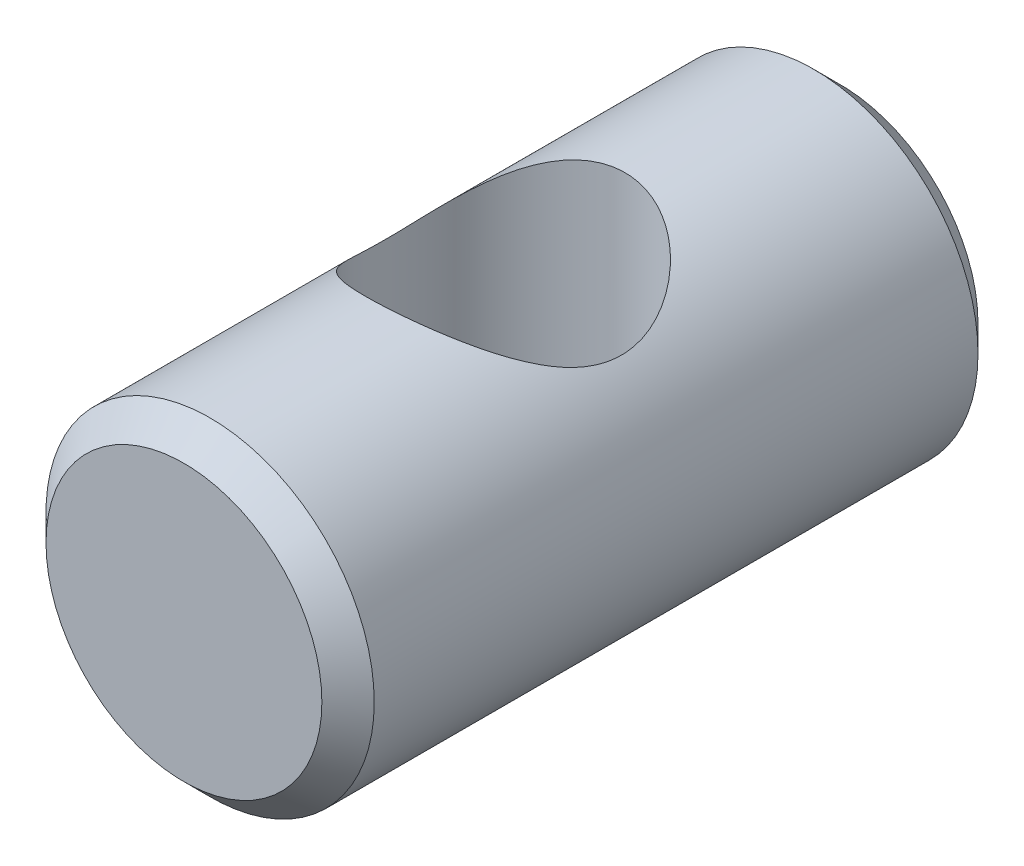
ISO-10303-21;
HEADER;
FILE_DESCRIPTION(('STEP AP214'),'2;1');
FILE_NAME('part.step','',(''),(''),'','','');
FILE_SCHEMA(('AUTOMOTIVE_DESIGN { 1 0 10303 214 1 1 1 1 }'));
ENDSEC;
DATA;
#1=APPLICATION_CONTEXT('core data for automotive mechanical design processes');
#2=APPLICATION_PROTOCOL_DEFINITION('international standard','automotive_design',2000,#1);
#3=PRODUCT_CONTEXT('',#1,'mechanical');
#4=PRODUCT('Part','Part','',(#3));
#5=PRODUCT_RELATED_PRODUCT_CATEGORY('part','',(#4));
#6=PRODUCT_DEFINITION_FORMATION('','',#4);
#7=PRODUCT_DEFINITION_CONTEXT('part definition',#1,'design');
#8=PRODUCT_DEFINITION('design','',#6,#7);
#9=PRODUCT_DEFINITION_SHAPE('','',#8);
#10=(LENGTH_UNIT() NAMED_UNIT(*) SI_UNIT(.MILLI.,.METRE.));
#11=(NAMED_UNIT(*) PLANE_ANGLE_UNIT() SI_UNIT($,.RADIAN.));
#12=(NAMED_UNIT(*) SI_UNIT($,.STERADIAN.) SOLID_ANGLE_UNIT());
#13=UNCERTAINTY_MEASURE_WITH_UNIT(LENGTH_MEASURE(1.E-05),#10,'distance_accuracy_value','');
#14=(GEOMETRIC_REPRESENTATION_CONTEXT(3) GLOBAL_UNCERTAINTY_ASSIGNED_CONTEXT((#13)) GLOBAL_UNIT_ASSIGNED_CONTEXT((#10,
#11,#12)) REPRESENTATION_CONTEXT('',''));
#15=CARTESIAN_POINT('',(0.,0.,0.));
#16=DIRECTION('',(0.,0.,1.));
#17=DIRECTION('',(1.,0.,0.));
#18=AXIS2_PLACEMENT_3D('',#15,#16,#17);
#19=CARTESIAN_POINT('',(0.,0.,9.525));
#20=DIRECTION('',(0.,0.,-1.));
#21=DIRECTION('',(-1.,0.,0.));
#22=AXIS2_PLACEMENT_3D('',#19,#20,#21);
#23=CYLINDRICAL_SURFACE('',#22,4.765);
#24=CARTESIAN_POINT('',(0.,-4.765,-3.42087708051605));
#25=CARTESIAN_POINT('',(-0.0833627581168181,-4.7649997101109,-3.42696899134863));
#26=CARTESIAN_POINT('',(-0.166953392424251,-4.76280757869707,-3.43001003086423));
#27=CARTESIAN_POINT('',(-0.333933182408652,-4.75402028790231,-3.4299899120654));
#28=CARTESIAN_POINT('',(-0.41732223719261,-4.74742325494959,-3.42692615604904));
#29=CARTESIAN_POINT('',(-0.583312250165056,-4.72989865727235,-3.41478160746824));
#30=CARTESIAN_POINT('',(-0.665912068503747,-4.71896558414041,-3.40569315136156));
#31=CARTESIAN_POINT('',(-0.829610597514771,-4.69295834085159,-3.38168739143667));
#32=CARTESIAN_POINT('',(-0.91070865358331,-4.67788240819801,-3.36676760565251));
#33=CARTESIAN_POINT('',(-1.15000632689336,-4.62699847385246,-3.31382161536753));
#34=CARTESIAN_POINT('',(-1.30524951697123,-4.58542013528299,-3.26752778272676));
#35=CARTESIAN_POINT('',(-1.60411463212557,-4.48962808746058,-3.15544383432779));
#36=CARTESIAN_POINT('',(-1.74773682156028,-4.43541466574349,-3.08965416222603));
#37=CARTESIAN_POINT('',(-2.03259497643689,-4.31273538578719,-2.93522566350036));
#38=CARTESIAN_POINT('',(-2.17272279857911,-4.24347672491827,-2.84518090003159));
#39=CARTESIAN_POINT('',(-2.43631552731587,-4.09784606286129,-2.64803347355049));
#40=CARTESIAN_POINT('',(-2.55976291960052,-4.02146672501527,-2.54091313456509));
#41=CARTESIAN_POINT('',(-2.81327393100644,-3.84950291536883,-2.28757037498761));
#42=CARTESIAN_POINT('',(-2.93940806717613,-3.75321839663728,-2.13784494064544));
#43=CARTESIAN_POINT('',(-3.10885207016274,-3.61188607024724,-1.89774924473951));
#44=CARTESIAN_POINT('',(-3.16205944901992,-3.56527135977744,-1.81509327318893));
#45=CARTESIAN_POINT('',(-3.26165283895997,-3.47438917550769,-1.64456461914389));
#46=CARTESIAN_POINT('',(-3.30804141803447,-3.43012082209569,-1.55669391813204));
#47=CARTESIAN_POINT('',(-3.41144333221737,-3.32784018306176,-1.33801732923479));
#48=CARTESIAN_POINT('',(-3.46485738281701,-3.27176419567389,-1.20454764001565));
#49=CARTESIAN_POINT('',(-3.55539465585279,-3.1731532714438,-0.927567219273259));
#50=CARTESIAN_POINT('',(-3.59255605597934,-3.13058666617785,-0.784080947165172));
#51=CARTESIAN_POINT('',(-3.64343651296181,-3.07113542283653,-0.514646140223208));
#52=CARTESIAN_POINT('',(-3.66010628533956,-3.05107413064414,-0.389980532152302));
#53=CARTESIAN_POINT('',(-3.67954153570878,-3.02761567970702,-0.138051441971629));
#54=CARTESIAN_POINT('',(-3.68232117171679,-3.02420155283186,-0.0107907379518645));
#55=CARTESIAN_POINT('',(-3.67376621747767,-3.03458366659267,0.242449329866107));
#56=CARTESIAN_POINT('',(-3.66243797397314,-3.04837216824954,0.36842924415841));
#57=CARTESIAN_POINT('',(-3.62657095184853,-3.09094772918142,0.615927376424318));
#58=CARTESIAN_POINT('',(-3.60201250089043,-3.11975712134959,0.737438661719832));
#59=CARTESIAN_POINT('',(-3.52797021750044,-3.20358122773375,1.02486117239319));
#60=CARTESIAN_POINT('',(-3.47231020523667,-3.26453704351351,1.18741075414518));
#61=CARTESIAN_POINT('',(-3.34017866781708,-3.39961296516166,1.498121783823));
#62=CARTESIAN_POINT('',(-3.2636446149314,-3.47377238661047,1.64623815847782));
#63=CARTESIAN_POINT('',(-3.12200897105521,-3.60054284241464,1.87825971607124));
#64=CARTESIAN_POINT('',(-3.06234750531042,-3.65156363596669,1.9664324955114));
#65=CARTESIAN_POINT('',(-2.93536296354977,-3.75440484501345,2.13658829521524));
#66=CARTESIAN_POINT('',(-2.86803758566651,-3.80622549668558,2.21856944344932));
#67=CARTESIAN_POINT('',(-2.65493557738645,-3.96070606463684,2.4548169203279));
#68=CARTESIAN_POINT('',(-2.4978237985218,-4.06258137631192,2.59972905493882));
#69=CARTESIAN_POINT('',(-2.18575837138568,-4.23718725327564,2.83706621766583));
#70=CARTESIAN_POINT('',(-2.03548298499758,-4.31186637762032,2.93424360521689));
#71=CARTESIAN_POINT('',(-1.71702572980925,-4.44824656330391,3.10568912436018));
#72=CARTESIAN_POINT('',(-1.54887024912961,-4.50996636079322,3.17999040299218));
#73=CARTESIAN_POINT('',(-1.22389848309852,-4.60778480850806,3.29263516387729));
#74=CARTESIAN_POINT('',(-1.06910753325383,-4.64632732736096,3.33468022800881));
#75=CARTESIAN_POINT('',(-0.75219098421797,-4.70801774696666,3.39687013419293));
#76=CARTESIAN_POINT('',(-0.590069112764686,-4.73117337991453,3.4170259792185));
#77=CARTESIAN_POINT('',(-0.262598143568302,-4.7606051003247,3.43390286080123));
#78=CARTESIAN_POINT('',(-0.0972412962651627,-4.76683385814853,3.43055828056669));
#79=CARTESIAN_POINT('',(0.231024129353294,-4.76222706928004,3.40010195996678));
#80=CARTESIAN_POINT('',(0.393932420256087,-4.75138953488968,3.37298745129903));
#81=CARTESIAN_POINT('',(0.705514268669749,-4.71498049061455,3.29795083571309));
#82=CARTESIAN_POINT('',(0.854498752183595,-4.69006694126301,3.25098003249397));
#83=CARTESIAN_POINT('',(1.14256413370517,-4.62833634686259,3.13840780618742));
#84=CARTESIAN_POINT('',(1.28164310390505,-4.59151699239254,3.07280276883643));
#85=CARTESIAN_POINT('',(1.5605913242394,-4.50478911028579,2.91796402171938));
#86=CARTESIAN_POINT('',(1.6992420339739,-4.45396042558585,2.82706121692328));
#87=CARTESIAN_POINT('',(1.96045324775842,-4.34533105232053,2.62789389216064));
#88=CARTESIAN_POINT('',(2.08299871660834,-4.28752394420402,2.51961335554432));
#89=CARTESIAN_POINT('',(2.33061071233595,-4.15886196775128,2.26753986981794));
#90=CARTESIAN_POINT('',(2.4524560274696,-4.08747815085455,2.12084350362776));
#91=CARTESIAN_POINT('',(2.67091966387117,-3.94818744226299,1.80818256348861));
#92=CARTESIAN_POINT('',(2.76753692468302,-3.88028069682256,1.64221717999394));
#93=CARTESIAN_POINT('',(2.91829752704228,-3.76775877390235,1.32363316444147));
#94=CARTESIAN_POINT('',(2.97693831230802,-3.72114907301219,1.17388770573104));
#95=CARTESIAN_POINT('',(3.04915600293589,-3.66180847873486,0.941826581338288));
#96=CARTESIAN_POINT('',(3.0706008978109,-3.64379412637323,0.863255129060429));
#97=CARTESIAN_POINT('',(3.10797188341904,-3.61197174564401,0.703992654043783));
#98=CARTESIAN_POINT('',(3.12390068817333,-3.59816164910817,0.623302694735667));
#99=CARTESIAN_POINT('',(3.15010468685879,-3.57524455910332,0.459495462666012));
#100=CARTESIAN_POINT('',(3.16032158062367,-3.5661861203942,0.376361962516609));
#101=CARTESIAN_POINT('',(3.17464168800661,-3.55344451616001,0.209195138832906));
#102=CARTESIAN_POINT('',(3.17874788699032,-3.54975872585817,0.125162274904951));
#103=CARTESIAN_POINT('',(3.18076053743013,-3.54795587812489,-0.0430393452037699));
#104=CARTESIAN_POINT('',(3.17866722999483,-3.54983860412504,-0.127208095972439));
#105=CARTESIAN_POINT('',(3.16833758034575,-3.55905933774995,-0.294840628996082));
#106=CARTESIAN_POINT('',(3.16010150131517,-3.56639711165655,-0.37830444129877));
#107=CARTESIAN_POINT('',(3.129430196119,-3.59341005189328,-0.604314657609787));
#108=CARTESIAN_POINT('',(3.10101793603989,-3.61818171011667,-0.745494317394037));
#109=CARTESIAN_POINT('',(3.02771937958645,-3.67972750014127,-1.02069983126741));
#110=CARTESIAN_POINT('',(2.98281650470617,-3.71651370639189,-1.15471833017231));
#111=CARTESIAN_POINT('',(2.8560768918245,-3.8153502491925,-1.46853642894097));
#112=CARTESIAN_POINT('',(2.76664814536404,-3.88152734494911,-1.64398166227299));
#113=CARTESIAN_POINT('',(2.56077346334119,-4.02033820070584,-1.97551522842484));
#114=CARTESIAN_POINT('',(2.44428083509273,-4.09298298410994,-2.13156938380249));
#115=CARTESIAN_POINT('',(2.18450650401399,-4.2373970566927,-2.42421216807333));
#116=CARTESIAN_POINT('',(2.04090097393914,-4.30914323590254,-2.56052605726515));
#117=CARTESIAN_POINT('',(1.72973058522059,-4.44318432752427,-2.80802181758103));
#118=CARTESIAN_POINT('',(1.56219804304703,-4.50549175797245,-2.91923707314103));
#119=CARTESIAN_POINT('',(1.23969583506405,-4.60338031575656,-3.09396462152009));
#120=CARTESIAN_POINT('',(1.08834922542923,-4.64178783933997,-3.16252149709776));
#121=CARTESIAN_POINT('',(0.853387810710914,-4.68864069192958,-3.24875451241662));
#122=CARTESIAN_POINT('',(0.773800863355163,-4.70245945854321,-3.27471971164357));
#123=CARTESIAN_POINT('',(0.612411306870991,-4.72618391319332,-3.32087000112459));
#124=CARTESIAN_POINT('',(0.530609679466052,-4.73609130567107,-3.34105760799584));
#125=CARTESIAN_POINT('',(0.374335243630171,-4.75084997254152,-3.37353939001354));
#126=CARTESIAN_POINT('',(0.300030947704153,-4.75613339853629,-3.38645258471521));
#127=CARTESIAN_POINT('',(0.150546671086997,-4.76320900575073,-3.40736829831093));
#128=CARTESIAN_POINT('',(0.0753664637160956,-4.76500026208246,-3.41536951590209));
#129=CARTESIAN_POINT('',(0.,-4.765,-3.42087708051605));
#130=B_SPLINE_CURVE_WITH_KNOTS('',3,(#24,#25,#26,#27,#28,#29,#30,#31,#32,#33,#34,#35,#36,#37,
#38,#39,#40,#41,#42,#43,#44,#45,#46,#47,#48,#49,#50,#51,#52,#53,#54,#55,#56,#57,#58,#59,#60,#61,
#62,#63,#64,#65,#66,#67,#68,#69,#70,#71,#72,#73,#74,#75,#76,#77,#78,#79,#80,#81,#82,#83,#84,#85,
#86,#87,#88,#89,#90,#91,#92,#93,#94,#95,#96,#97,#98,#99,#100,#101,#102,#103,#104,#105,#106,#107,
#108,#109,#110,#111,#112,#113,#114,#115,#116,#117,#118,#119,#120,#121,#122,#123,#124,#125,#126,
#127,#128,#129),.UNSPECIFIED.,.T.,.F.,(4,2,2,2,2,2,2,2,2,2,2,2,2,2,2,2,2,2,2,2,2,2,2,2,2,2,2,2,
2,2,2,2,2,2,2,2,2,2,2,2,2,2,2,2,2,2,2,2,2,2,2,2,4),(0.,0.250678148817341,0.501462988541287,
0.752567445437252,1.00377889552888,1.50309474088369,2.00239922444642,2.54160992918404,
3.08138247258981,3.73300244855075,4.05909733145616,4.38506908912952,4.84654436743379,
5.30692973453839,5.68734604359481,6.06737452056514,6.44723209503533,6.82765605484285,
7.37157480546313,7.91714109472132,8.27090631470675,8.62477807035776,9.33119791439566,
9.91077027397039,10.4894988486046,10.9822712500665,11.4747958366297,11.9686961727678,
12.4626540373564,12.9352342359093,13.4079061579591,13.9261848288361,14.4449439577641,
15.0533142145202,15.6617100398795,16.1619385675779,16.4119146790501,16.6617676221917,
16.9141262556176,17.1663615593023,17.4185870532858,17.6708017414466,18.1072101440206,
18.5440584873629,19.1640002904501,19.7850197135797,20.4139885307568,21.0421157411608,
21.5513660687497,21.8056438515067,22.059810706191,22.2863833912941,22.5130160751694),.UNSPECIFIED.);
#131=CARTESIAN_POINT('',(0.,-4.765,-3.42087708051605));
#132=VERTEX_POINT('',#131);
#133=EDGE_CURVE('E10',#132,#132,#130,.T.);
#134=ORIENTED_EDGE('',*,*,#133,.T.);
#135=EDGE_LOOP('',(#134));
#136=FACE_BOUND('',#135,.T.);
#137=CARTESIAN_POINT('',(-0.25,4.75843724346555,3.43));
#138=CARTESIAN_POINT('',(-0.422180009069406,4.749390618167,3.42999980483541));
#139=CARTESIAN_POINT('',(-0.59386282730199,4.73091871113112,3.41695856293195));
#140=CARTESIAN_POINT('',(-0.930629104770302,4.67635636796384,3.36610979440147));
#141=CARTESIAN_POINT('',(-1.09570851357914,4.64025529237457,3.32828730721862));
#142=CARTESIAN_POINT('',(-1.41392411864396,4.55336447971862,3.23075051942857));
#143=CARTESIAN_POINT('',(-1.56712334101048,4.5026601113221,3.17116292636266));
#144=CARTESIAN_POINT('',(-1.85998836726663,4.38979766700268,3.03299834240104));
#145=CARTESIAN_POINT('',(-1.99965414606241,4.32763956984278,2.95442131629586));
#146=CARTESIAN_POINT('',(-2.27820698899914,4.18828982189439,2.77162910883962));
#147=CARTESIAN_POINT('',(-2.41542819149111,4.11020218068904,2.66557505303866));
#148=CARTESIAN_POINT('',(-2.67111072919315,3.94883137284482,2.43572487373919));
#149=CARTESIAN_POINT('',(-2.78953546002452,3.86553849846079,2.31189500490524));
#150=CARTESIAN_POINT('',(-2.96344629098399,3.732292646302,2.10063521621267));
#151=CARTESIAN_POINT('',(-3.02522112465854,3.68226630299909,2.01833701427756));
#152=CARTESIAN_POINT('',(-3.14150590868554,3.58357003530251,1.84790207991889));
#153=CARTESIAN_POINT('',(-3.1960131207988,3.5349006275963,1.7597631654945));
#154=CARTESIAN_POINT('',(-3.29731229261899,3.44060115304685,1.57784833521894));
#155=CARTESIAN_POINT('',(-3.34411822611588,3.39496567295495,1.48408305992192));
#156=CARTESIAN_POINT('',(-3.42959137880208,3.30859742398811,1.29083456033671));
#157=CARTESIAN_POINT('',(-3.46826509160405,3.2678607546062,1.19135597958454));
#158=CARTESIAN_POINT('',(-3.54347659526858,3.18632211811376,0.966712328692859));
#159=CARTESIAN_POINT('',(-3.57812346664731,3.14705996480953,0.840323998552467));
#160=CARTESIAN_POINT('',(-3.63302442402354,3.08352956814293,0.58097620836193));
#161=CARTESIAN_POINT('',(-3.65331272726122,3.05922569654857,0.448033183521055));
#162=CARTESIAN_POINT('',(-3.67812283683354,3.02936636632518,0.177337549423229));
#163=CARTESIAN_POINT('',(-3.68251233934075,3.02396824643502,0.0395541719109326));
#164=CARTESIAN_POINT('',(-3.67470644643728,3.03344305810687,-0.23487587460697));
#165=CARTESIAN_POINT('',(-3.66249943392474,3.04833018879986,-0.371521679960182));
#166=CARTESIAN_POINT('',(-3.62015799382368,3.09852315491188,-0.655828380639311));
#167=CARTESIAN_POINT('',(-3.58799174144691,3.13612809889826,-0.802759414360213));
#168=CARTESIAN_POINT('',(-3.50660899556505,3.22685391573892,-1.08690765852794));
#169=CARTESIAN_POINT('',(-3.45734815065714,3.28001509196861,-1.22409847190397));
#170=CARTESIAN_POINT('',(-3.35999029035731,3.37921222953507,-1.45031682658415));
#171=CARTESIAN_POINT('',(-3.31552748835514,3.42299124550292,-1.54196683547208));
#172=CARTESIAN_POINT('',(-3.21937168211258,3.51357799533849,-1.7198719105116));
#173=CARTESIAN_POINT('',(-3.16767569861283,3.56038697291962,-1.80612473233374));
#174=CARTESIAN_POINT('',(-3.05733519065029,3.65557723444101,-1.97327341136436));
#175=CARTESIAN_POINT('',(-2.99868376029761,3.70396004583247,-2.05416381804876));
#176=CARTESIAN_POINT('',(-2.87465956601933,3.80102084509467,-2.21043246978884));
#177=CARTESIAN_POINT('',(-2.80928649472037,3.84969884636826,-2.28581046249784));
#178=CARTESIAN_POINT('',(-2.6702557671566,3.94744940552613,-2.43263894546763));
#179=CARTESIAN_POINT('',(-2.59643405525365,3.99650228404324,-2.50394748039488));
#180=CARTESIAN_POINT('',(-2.44198609531555,4.09270177982323,-2.64020867362414));
#181=CARTESIAN_POINT('',(-2.36135999487914,4.13984843840248,-2.70516146972696));
#182=CARTESIAN_POINT('',(-2.19361254846785,4.2311207520192,-2.82808330517596));
#183=CARTESIAN_POINT('',(-2.10650409604225,4.27525208591359,-2.88606563800174));
#184=CARTESIAN_POINT('',(-1.92594548966524,4.3595756679867,-2.99452956360935));
#185=CARTESIAN_POINT('',(-1.83249514460759,4.39976779737237,-3.04501093021117));
#186=CARTESIAN_POINT('',(-1.58991791011193,4.49465680101692,-3.16160717844564));
#187=CARTESIAN_POINT('',(-1.43688887677842,4.54617300319559,-3.22239703143537));
#188=CARTESIAN_POINT('',(-1.11985321098478,4.63445714602499,-3.3220213557935));
#189=CARTESIAN_POINT('',(-0.955854490731871,4.67123558567514,-3.36087146486794));
#190=CARTESIAN_POINT('',(-0.620041304864633,4.72756501903715,-3.41423360193657));
#191=CARTESIAN_POINT('',(-0.448189976813921,4.74702354164412,-3.42861536060857));
#192=CARTESIAN_POINT('',(-0.103195532056556,4.76701209164517,-3.43119218349009));
#193=CARTESIAN_POINT('',(0.06994727139145,4.76754656888776,-3.41939340455174));
#194=CARTESIAN_POINT('',(0.396800733953036,4.75102741592386,-3.37216085402572));
#195=CARTESIAN_POINT('',(0.550903795546914,4.73547935394817,-3.33884247322146));
#196=CARTESIAN_POINT('',(0.851262679297082,4.69080460019725,-3.25216372524372));
#197=CARTESIAN_POINT('',(0.997516834516372,4.66167503663273,-3.19879911978833));
#198=CARTESIAN_POINT('',(1.28614476637547,4.59066745677348,-3.0710403225626));
#199=CARTESIAN_POINT('',(1.42797966766526,4.5482360225696,-2.99574591149816));
#200=CARTESIAN_POINT('',(1.69771873358212,4.45459184021555,-2.82781924377908));
#201=CARTESIAN_POINT('',(1.82561916137349,4.40337674596602,-2.73518235437366));
#202=CARTESIAN_POINT('',(2.08559098582612,4.28706511495821,-2.51852707855975));
#203=CARTESIAN_POINT('',(2.2150420244168,4.22105957781513,-2.39185853378127));
#204=CARTESIAN_POINT('',(2.4525288591269,4.08765163666692,-2.11988296233599));
#205=CARTESIAN_POINT('',(2.56051870491995,4.02024656957631,-1.97453701758846));
#206=CARTESIAN_POINT('',(2.71141297716131,3.91890470250436,-1.73364032653499));
#207=CARTESIAN_POINT('',(2.76225962831151,3.88310759046257,-1.64375989611526));
#208=CARTESIAN_POINT('',(2.85606768069206,3.81463871939836,-1.45876664530863));
#209=CARTESIAN_POINT('',(2.8990272649147,3.78196768138302,-1.36365262576038));
#210=CARTESIAN_POINT('',(2.97638382467227,3.7213945324715,-1.16888238761678));
#211=CARTESIAN_POINT('',(3.01080676435227,3.6934780438477,-1.06924106056855));
#212=CARTESIAN_POINT('',(3.07061216797024,3.64390866973889,-0.865836413850729));
#213=CARTESIAN_POINT('',(3.09600079900905,3.62225151334222,-0.762075960014789));
#214=CARTESIAN_POINT('',(3.14431905107756,3.58048576732931,-0.514276109849917));
#215=CARTESIAN_POINT('',(3.1632690781055,3.56357947310397,-0.368863877264377));
#216=CARTESIAN_POINT('',(3.18229415057448,3.54660528363274,-0.0759553160984811));
#217=CARTESIAN_POINT('',(3.18238833621042,3.54652031339164,0.0715387471135857));
#218=CARTESIAN_POINT('',(3.16376347579515,3.56313911837428,0.364127843469745));
#219=CARTESIAN_POINT('',(3.14506985693007,3.57982020262542,0.509225849632988));
#220=CARTESIAN_POINT('',(3.09006178812862,3.6274007096972,0.793694678976371));
#221=CARTESIAN_POINT('',(3.05372153995533,3.65832094581284,0.93305679207045));
#222=CARTESIAN_POINT('',(2.94995679839854,3.74283457822027,1.249627259653));
#223=CARTESIAN_POINT('',(2.8761691317453,3.80056128592335,1.42363336901505));
#224=CARTESIAN_POINT('',(2.70309172031867,3.92554694052951,1.75476054116614));
#225=CARTESIAN_POINT('',(2.60375916203549,3.99282180458683,1.91185262262683));
#226=CARTESIAN_POINT('',(2.37965965281677,4.1303821812455,2.21024978907531));
#227=CARTESIAN_POINT('',(2.25446848393284,4.20070005001654,2.35122119961122));
#228=CARTESIAN_POINT('',(1.98132226028617,4.33621841215064,2.61183089931649));
#229=CARTESIAN_POINT('',(1.83339056066264,4.40142405331531,2.73149080683867));
#230=CARTESIAN_POINT('',(1.53413492006617,4.51378899534322,2.93439863762913));
#231=CARTESIAN_POINT('',(1.38501302638155,4.56214832085995,3.02021473285691));
#232=CARTESIAN_POINT('',(1.07249564524744,4.64554146755817,3.16951406225263));
#233=CARTESIAN_POINT('',(0.909111289256097,4.68058556855773,3.23301452201411));
#234=CARTESIAN_POINT('',(0.581478494873652,4.73212589223905,3.33183530764178));
#235=CARTESIAN_POINT('',(0.417802064196764,4.74955942472212,3.36854686433097));
#236=CARTESIAN_POINT('',(0.0859254534274394,4.76711849433294,3.41762518536938));
#237=CARTESIAN_POINT('',(-0.0822731758795966,4.76724989098796,3.43000019011694));
#238=CARTESIAN_POINT('',(-0.25,4.75843724346555,3.43));
#239=B_SPLINE_CURVE_WITH_KNOTS('',3,(#137,#138,#139,#140,#141,#142,#143,#144,#145,#146,#147,
#148,#149,#150,#151,#152,#153,#154,#155,#156,#157,#158,#159,#160,#161,#162,#163,#164,#165,#166,
#167,#168,#169,#170,#171,#172,#173,#174,#175,#176,#177,#178,#179,#180,#181,#182,#183,#184,#185,
#186,#187,#188,#189,#190,#191,#192,#193,#194,#195,#196,#197,#198,#199,#200,#201,#202,#203,#204,
#205,#206,#207,#208,#209,#210,#211,#212,#213,#214,#215,#216,#217,#218,#219,#220,#221,#222,#223,
#224,#225,#226,#227,#228,#229,#230,#231,#232,#233,#234,#235,#236,#237,#238),.UNSPECIFIED.,.T.,
.F.,(4,2,2,2,2,2,2,2,2,2,2,2,2,2,2,2,2,2,2,2,2,2,2,2,2,2,2,2,2,2,2,2,2,2,2,2,2,2,2,2,2,2,2,2,2,
2,2,2,2,2,4),(0.,0.516551025096824,1.03341418220019,1.54731512007828,2.06121701081903,
2.62982932183038,3.19953571462131,3.54246459279583,3.88552231417978,4.22795053195656,
4.57010427222594,4.97905439316964,5.38702665221779,5.79838620186915,6.21003384012951,
6.67262967068467,7.1364347778277,7.46866532411958,7.80103311718076,8.13373371721725,
8.46644953806418,8.80733809568013,9.14821926074384,9.48843965067855,9.82867029735157,
10.3440014803113,10.8589648922706,11.3766614843259,11.8942363430695,12.3673901670618,
12.8406440841658,13.3370245096255,13.8335377244494,14.4096746680997,14.9870321881218,
15.3145391492316,15.6421214663625,15.968694875667,16.2950449261748,16.7357599059526,
17.1760275223247,17.6157000871626,18.0560173690192,18.6457302885718,19.2364380888803,
19.8377403374759,20.4384291081866,20.9723943239786,21.5059464582794,22.0093081125728,
22.5124992983782),.UNSPECIFIED.);
#240=CARTESIAN_POINT('',(-0.25,4.75843724346555,3.43));
#241=VERTEX_POINT('',#240);
#242=EDGE_CURVE('E56',#241,#241,#239,.T.);
#243=ORIENTED_EDGE('',*,*,#242,.T.);
#244=EDGE_LOOP('',(#243));
#245=FACE_BOUND('',#244,.T.);
#246=CARTESIAN_POINT('',(0.,0.,-8.76499999999999));
#247=DIRECTION('',(0.,0.,1.));
#248=DIRECTION('',(1.,0.,0.));
#249=AXIS2_PLACEMENT_3D('',#246,#247,#248);
#250=CIRCLE('',#249,4.765);
#251=CARTESIAN_POINT('',(4.765,0.,-8.76499999999999));
#252=VERTEX_POINT('',#251);
#253=EDGE_CURVE('E99',#252,#252,#250,.T.);
#254=ORIENTED_EDGE('',*,*,#253,.T.);
#255=EDGE_LOOP('',(#254));
#256=FACE_BOUND('',#255,.T.);
#257=CARTESIAN_POINT('',(0.,0.,8.76500000000001));
#258=DIRECTION('',(0.,0.,1.));
#259=DIRECTION('',(1.,0.,0.));
#260=AXIS2_PLACEMENT_3D('',#257,#258,#259);
#261=CIRCLE('',#260,4.765);
#262=CARTESIAN_POINT('',(4.765,0.,8.76500000000001));
#263=VERTEX_POINT('',#262);
#264=EDGE_CURVE('E102',#263,#263,#261,.F.);
#265=ORIENTED_EDGE('',*,*,#264,.T.);
#266=EDGE_LOOP('',(#265));
#267=FACE_BOUND('',#266,.T.);
#268=ADVANCED_FACE('F42',(#136,#245,#256,#267),#23,.T.);
#269=CARTESIAN_POINT('',(0.,0.,9.525));
#270=DIRECTION('',(0.,0.,1.));
#271=DIRECTION('',(1.,0.,0.));
#272=AXIS2_PLACEMENT_3D('',#269,#270,#271);
#273=PLANE('',#272);
#274=CARTESIAN_POINT('',(0.,0.,9.525));
#275=DIRECTION('',(0.,0.,1.));
#276=DIRECTION('',(1.,0.,0.));
#277=AXIS2_PLACEMENT_3D('',#274,#275,#276);
#278=CIRCLE('',#277,4.00500000000001);
#279=CARTESIAN_POINT('',(4.00500000000001,0.,9.525));
#280=VERTEX_POINT('',#279);
#281=EDGE_CURVE('E61',#280,#280,#278,.T.);
#282=ORIENTED_EDGE('',*,*,#281,.T.);
#283=EDGE_LOOP('',(#282));
#284=FACE_BOUND('',#283,.T.);
#285=ADVANCED_FACE('F79',(#284),#273,.T.);
#286=CARTESIAN_POINT('',(0.,0.,-9.525));
#287=DIRECTION('',(0.,0.,1.));
#288=DIRECTION('',(1.,0.,0.));
#289=AXIS2_PLACEMENT_3D('',#286,#287,#288);
#290=PLANE('',#289);
#291=CARTESIAN_POINT('',(0.,0.,-9.525));
#292=DIRECTION('',(0.,0.,1.));
#293=DIRECTION('',(1.,0.,0.));
#294=AXIS2_PLACEMENT_3D('',#291,#292,#293);
#295=CIRCLE('',#294,4.00499999999998);
#296=CARTESIAN_POINT('',(4.00499999999998,0.,-9.525));
#297=VERTEX_POINT('',#296);
#298=EDGE_CURVE('E66',#297,#297,#295,.F.);
#299=ORIENTED_EDGE('',*,*,#298,.T.);
#300=EDGE_LOOP('',(#299));
#301=FACE_BOUND('',#300,.T.);
#302=ADVANCED_FACE('F82',(#301),#290,.F.);
#303=CARTESIAN_POINT('',(0.,0.,-8.76499999999999));
#304=DIRECTION('',(0.,0.,1.));
#305=DIRECTION('',(1.,0.,0.));
#306=AXIS2_PLACEMENT_3D('',#303,#304,#305);
#307=CONICAL_SURFACE('',#306,4.765,0.785398163397451);
#308=ORIENTED_EDGE('',*,*,#298,.F.);
#309=EDGE_LOOP('',(#308));
#310=FACE_BOUND('',#309,.T.);
#311=ORIENTED_EDGE('',*,*,#253,.F.);
#312=EDGE_LOOP('',(#311));
#313=FACE_BOUND('',#312,.T.);
#314=ADVANCED_FACE('F85',(#310,#313),#307,.T.);
#315=CARTESIAN_POINT('',(0.,0.,9.525));
#316=DIRECTION('',(0.,0.,-1.));
#317=DIRECTION('',(-1.,0.,0.));
#318=AXIS2_PLACEMENT_3D('',#315,#316,#317);
#319=CONICAL_SURFACE('',#318,4.00500000000001,0.785398163397448);
#320=ORIENTED_EDGE('',*,*,#264,.F.);
#321=EDGE_LOOP('',(#320));
#322=FACE_BOUND('',#321,.T.);
#323=ORIENTED_EDGE('',*,*,#281,.F.);
#324=EDGE_LOOP('',(#323));
#325=FACE_BOUND('',#324,.T.);
#326=ADVANCED_FACE('F45',(#322,#325),#319,.T.);
#327=CARTESIAN_POINT('',(-0.25,-4.765,0.));
#328=DIRECTION('',(0.,1.,0.));
#329=DIRECTION('',(0.,0.,1.));
#330=AXIS2_PLACEMENT_3D('',#327,#328,#329);
#331=CYLINDRICAL_SURFACE('',#330,3.43);
#332=ORIENTED_EDGE('',*,*,#242,.F.);
#333=EDGE_LOOP('',(#332));
#334=FACE_BOUND('',#333,.T.);
#335=ORIENTED_EDGE('',*,*,#133,.F.);
#336=EDGE_LOOP('',(#335));
#337=FACE_BOUND('',#336,.T.);
#338=ADVANCED_FACE('F74',(#334,#337),#331,.F.);
#339=CLOSED_SHELL('',(#268,#285,#302,#314,#326,#338));
#340=MANIFOLD_SOLID_BREP('B2',#339);
#341=ADVANCED_BREP_SHAPE_REPRESENTATION('',(#18,#340),#14);
#342=SHAPE_DEFINITION_REPRESENTATION(#9,#341);
ENDSEC;
END-ISO-10303-21;
